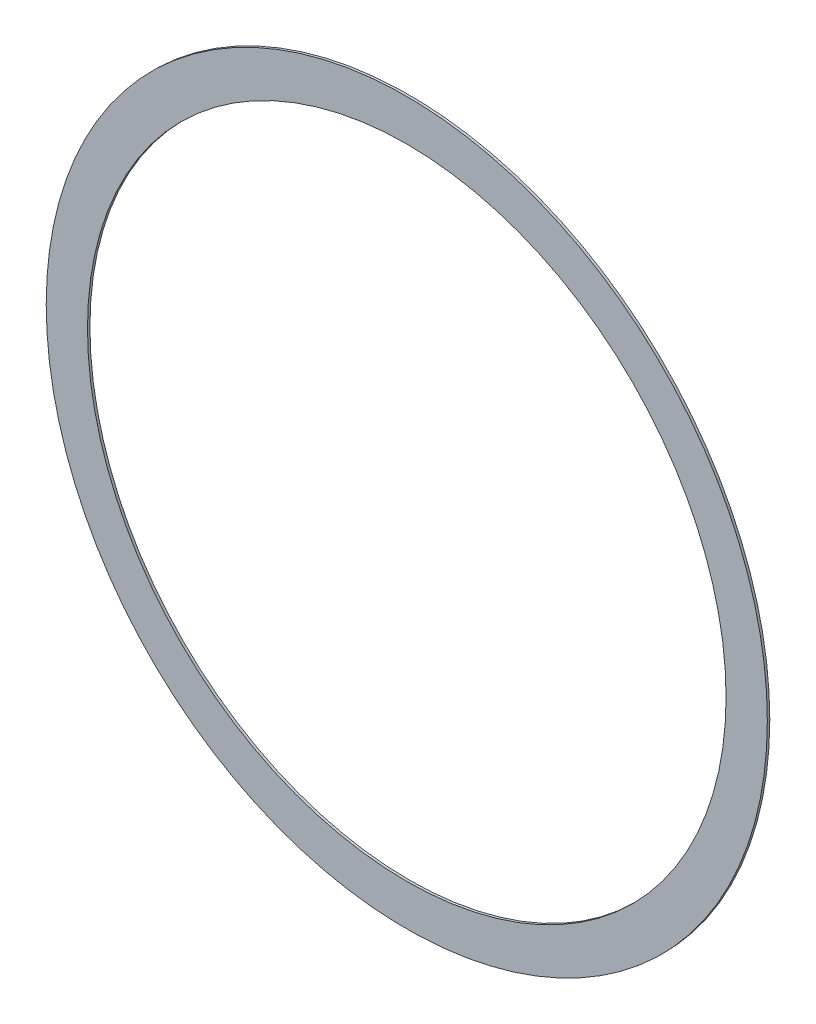
ISO-10303-21;
HEADER;
FILE_DESCRIPTION(('STEP AP214'),'2;1');
FILE_NAME('part.step','',(''),(''),'','','');
FILE_SCHEMA(('AUTOMOTIVE_DESIGN { 1 0 10303 214 1 1 1 1 }'));
ENDSEC;
DATA;
#1=APPLICATION_CONTEXT('core data for automotive mechanical design processes');
#2=APPLICATION_PROTOCOL_DEFINITION('international standard','automotive_design',2000,#1);
#3=PRODUCT_CONTEXT('',#1,'mechanical');
#4=PRODUCT('Part','Part','',(#3));
#5=PRODUCT_RELATED_PRODUCT_CATEGORY('part','',(#4));
#6=PRODUCT_DEFINITION_FORMATION('','',#4);
#7=PRODUCT_DEFINITION_CONTEXT('part definition',#1,'design');
#8=PRODUCT_DEFINITION('design','',#6,#7);
#9=PRODUCT_DEFINITION_SHAPE('','',#8);
#10=(LENGTH_UNIT() NAMED_UNIT(*) SI_UNIT(.MILLI.,.METRE.));
#11=(NAMED_UNIT(*) PLANE_ANGLE_UNIT() SI_UNIT($,.RADIAN.));
#12=(NAMED_UNIT(*) SI_UNIT($,.STERADIAN.) SOLID_ANGLE_UNIT());
#13=UNCERTAINTY_MEASURE_WITH_UNIT(LENGTH_MEASURE(1.E-05),#10,'distance_accuracy_value','');
#14=(GEOMETRIC_REPRESENTATION_CONTEXT(3) GLOBAL_UNCERTAINTY_ASSIGNED_CONTEXT((#13)) GLOBAL_UNIT_ASSIGNED_CONTEXT((#10,
#11,#12)) REPRESENTATION_CONTEXT('',''));
#15=CARTESIAN_POINT('',(0.,0.,0.));
#16=DIRECTION('',(0.,0.,1.));
#17=DIRECTION('',(1.,0.,0.));
#18=AXIS2_PLACEMENT_3D('',#15,#16,#17);
#19=CARTESIAN_POINT('',(0.,0.,0.5));
#20=DIRECTION('',(0.,0.,1.));
#21=DIRECTION('',(1.,0.,0.));
#22=AXIS2_PLACEMENT_3D('',#19,#20,#21);
#23=PLANE('',#22);
#24=CARTESIAN_POINT('',(0.,0.,0.5));
#25=DIRECTION('',(0.,0.,1.));
#26=DIRECTION('',(1.,0.,0.));
#27=AXIS2_PLACEMENT_3D('',#24,#25,#26);
#28=CIRCLE('',#27,73.4);
#29=CARTESIAN_POINT('',(73.4,0.,0.5));
#30=VERTEX_POINT('',#29);
#31=EDGE_CURVE('E10',#30,#30,#28,.T.);
#32=ORIENTED_EDGE('',*,*,#31,.T.);
#33=EDGE_LOOP('',(#32));
#34=FACE_BOUND('',#33,.T.);
#35=CARTESIAN_POINT('',(0.,0.,0.5));
#36=DIRECTION('',(0.,0.,1.));
#37=DIRECTION('',(1.,0.,0.));
#38=AXIS2_PLACEMENT_3D('',#35,#36,#37);
#39=CIRCLE('',#38,65.);
#40=CARTESIAN_POINT('',(65.,0.,0.5));
#41=VERTEX_POINT('',#40);
#42=EDGE_CURVE('E50',#41,#41,#39,.T.);
#43=ORIENTED_EDGE('',*,*,#42,.F.);
#44=EDGE_LOOP('',(#43));
#45=FACE_BOUND('',#44,.T.);
#46=ADVANCED_FACE('F37',(#34,#45),#23,.T.);
#47=CARTESIAN_POINT('',(0.,0.,0.));
#48=DIRECTION('',(0.,0.,1.));
#49=DIRECTION('',(1.,0.,0.));
#50=AXIS2_PLACEMENT_3D('',#47,#48,#49);
#51=PLANE('',#50);
#52=CARTESIAN_POINT('',(0.,0.,0.));
#53=DIRECTION('',(0.,0.,1.));
#54=DIRECTION('',(1.,0.,0.));
#55=AXIS2_PLACEMENT_3D('',#52,#53,#54);
#56=CIRCLE('',#55,73.4);
#57=CARTESIAN_POINT('',(73.4,0.,0.));
#58=VERTEX_POINT('',#57);
#59=EDGE_CURVE('E41',#58,#58,#56,.T.);
#60=ORIENTED_EDGE('',*,*,#59,.F.);
#61=EDGE_LOOP('',(#60));
#62=FACE_BOUND('',#61,.T.);
#63=CARTESIAN_POINT('',(0.,0.,0.));
#64=DIRECTION('',(0.,0.,1.));
#65=DIRECTION('',(1.,0.,0.));
#66=AXIS2_PLACEMENT_3D('',#63,#64,#65);
#67=CIRCLE('',#66,65.);
#68=CARTESIAN_POINT('',(65.,0.,0.));
#69=VERTEX_POINT('',#68);
#70=EDGE_CURVE('E52',#69,#69,#67,.T.);
#71=ORIENTED_EDGE('',*,*,#70,.T.);
#72=EDGE_LOOP('',(#71));
#73=FACE_BOUND('',#72,.T.);
#74=ADVANCED_FACE('F64',(#62,#73),#51,.F.);
#75=CARTESIAN_POINT('',(0.,0.,0.5));
#76=DIRECTION('',(0.,0.,-1.));
#77=DIRECTION('',(-1.,0.,0.));
#78=AXIS2_PLACEMENT_3D('',#75,#76,#77);
#79=CYLINDRICAL_SURFACE('',#78,73.4);
#80=ORIENTED_EDGE('',*,*,#31,.F.);
#81=EDGE_LOOP('',(#80));
#82=FACE_BOUND('',#81,.T.);
#83=ORIENTED_EDGE('',*,*,#59,.T.);
#84=EDGE_LOOP('',(#83));
#85=FACE_BOUND('',#84,.T.);
#86=ADVANCED_FACE('F39',(#82,#85),#79,.T.);
#87=CARTESIAN_POINT('',(0.,0.,0.5));
#88=DIRECTION('',(0.,0.,-1.));
#89=DIRECTION('',(-1.,0.,0.));
#90=AXIS2_PLACEMENT_3D('',#87,#88,#89);
#91=CYLINDRICAL_SURFACE('',#90,65.);
#92=ORIENTED_EDGE('',*,*,#42,.T.);
#93=EDGE_LOOP('',(#92));
#94=FACE_BOUND('',#93,.T.);
#95=ORIENTED_EDGE('',*,*,#70,.F.);
#96=EDGE_LOOP('',(#95));
#97=FACE_BOUND('',#96,.T.);
#98=ADVANCED_FACE('F60',(#94,#97),#91,.F.);
#99=CLOSED_SHELL('',(#46,#74,#86,#98));
#100=MANIFOLD_SOLID_BREP('B2',#99);
#101=ADVANCED_BREP_SHAPE_REPRESENTATION('',(#18,#100),#14);
#102=SHAPE_DEFINITION_REPRESENTATION(#9,#101);
ENDSEC;
END-ISO-10303-21;
